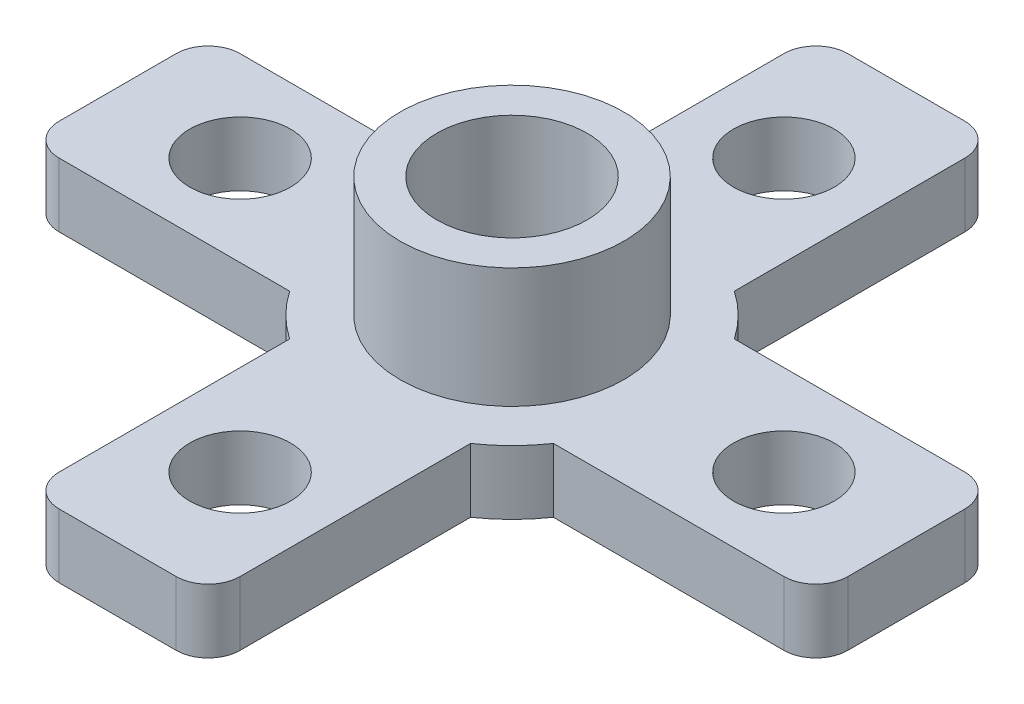
ISO-10303-21;
HEADER;
FILE_DESCRIPTION(('STEP AP214'),'2;1');
FILE_NAME('part.step','',(''),(''),'','','');
FILE_SCHEMA(('AUTOMOTIVE_DESIGN { 1 0 10303 214 1 1 1 1 }'));
ENDSEC;
DATA;
#1=APPLICATION_CONTEXT('core data for automotive mechanical design processes');
#2=APPLICATION_PROTOCOL_DEFINITION('international standard','automotive_design',2000,#1);
#3=PRODUCT_CONTEXT('',#1,'mechanical');
#4=PRODUCT('Part','Part','',(#3));
#5=PRODUCT_RELATED_PRODUCT_CATEGORY('part','',(#4));
#6=PRODUCT_DEFINITION_FORMATION('','',#4);
#7=PRODUCT_DEFINITION_CONTEXT('part definition',#1,'design');
#8=PRODUCT_DEFINITION('design','',#6,#7);
#9=PRODUCT_DEFINITION_SHAPE('','',#8);
#10=(LENGTH_UNIT() NAMED_UNIT(*) SI_UNIT(.MILLI.,.METRE.));
#11=(NAMED_UNIT(*) PLANE_ANGLE_UNIT() SI_UNIT($,.RADIAN.));
#12=(NAMED_UNIT(*) SI_UNIT($,.STERADIAN.) SOLID_ANGLE_UNIT());
#13=UNCERTAINTY_MEASURE_WITH_UNIT(LENGTH_MEASURE(1.E-05),#10,'distance_accuracy_value','');
#14=(GEOMETRIC_REPRESENTATION_CONTEXT(3) GLOBAL_UNCERTAINTY_ASSIGNED_CONTEXT((#13)) GLOBAL_UNIT_ASSIGNED_CONTEXT((#10,
#11,#12)) REPRESENTATION_CONTEXT('',''));
#15=CARTESIAN_POINT('',(0.,0.,0.));
#16=DIRECTION('',(0.,0.,1.));
#17=DIRECTION('',(1.,0.,0.));
#18=AXIS2_PLACEMENT_3D('',#15,#16,#17);
#19=CARTESIAN_POINT('',(0.,2.,0.));
#20=DIRECTION('',(0.,-1.,0.));
#21=DIRECTION('',(0.,0.,-1.));
#22=AXIS2_PLACEMENT_3D('',#19,#20,#21);
#23=CYLINDRICAL_SURFACE('',#22,3.);
#24=CARTESIAN_POINT('',(0.,1.,0.));
#25=DIRECTION('',(0.,1.,0.));
#26=DIRECTION('',(0.,0.,1.));
#27=AXIS2_PLACEMENT_3D('',#24,#25,#26);
#28=CIRCLE('',#27,3.);
#29=CARTESIAN_POINT('',(0.,1.,3.));
#30=VERTEX_POINT('',#29);
#31=EDGE_CURVE('E108',#30,#30,#28,.T.);
#32=ORIENTED_EDGE('',*,*,#31,.T.);
#33=EDGE_LOOP('',(#32));
#34=FACE_BOUND('',#33,.T.);
#35=CARTESIAN_POINT('',(0.,2.,0.));
#36=DIRECTION('',(0.,1.,0.));
#37=DIRECTION('',(0.,0.,1.));
#38=AXIS2_PLACEMENT_3D('',#35,#36,#37);
#39=CIRCLE('',#38,3.);
#40=CARTESIAN_POINT('',(0.,2.,3.));
#41=VERTEX_POINT('',#40);
#42=EDGE_CURVE('E104',#41,#41,#39,.T.);
#43=ORIENTED_EDGE('',*,*,#42,.F.);
#44=EDGE_LOOP('',(#43));
#45=FACE_BOUND('',#44,.T.);
#46=ADVANCED_FACE('F98',(#34,#45),#23,.T.);
#47=CARTESIAN_POINT('',(0.,2.,0.));
#48=DIRECTION('',(0.,-1.,0.));
#49=DIRECTION('',(0.,0.,-1.));
#50=AXIS2_PLACEMENT_3D('',#47,#48,#49);
#51=CYLINDRICAL_SURFACE('',#50,1.125);
#52=CARTESIAN_POINT('',(0.,1.,0.));
#53=DIRECTION('',(0.,1.,0.));
#54=DIRECTION('',(0.,0.,1.));
#55=AXIS2_PLACEMENT_3D('',#52,#53,#54);
#56=CIRCLE('',#55,1.125);
#57=CARTESIAN_POINT('',(0.,1.,1.125));
#58=VERTEX_POINT('',#57);
#59=EDGE_CURVE('E112',#58,#58,#56,.T.);
#60=ORIENTED_EDGE('',*,*,#59,.F.);
#61=EDGE_LOOP('',(#60));
#62=FACE_BOUND('',#61,.T.);
#63=CARTESIAN_POINT('',(0.,2.,0.));
#64=DIRECTION('',(0.,1.,0.));
#65=DIRECTION('',(0.,0.,1.));
#66=AXIS2_PLACEMENT_3D('',#63,#64,#65);
#67=CIRCLE('',#66,1.125);
#68=CARTESIAN_POINT('',(0.,2.,1.125));
#69=VERTEX_POINT('',#68);
#70=EDGE_CURVE('E12',#69,#69,#67,.T.);
#71=ORIENTED_EDGE('',*,*,#70,.T.);
#72=EDGE_LOOP('',(#71));
#73=FACE_BOUND('',#72,.T.);
#74=ADVANCED_FACE('F121',(#62,#73),#51,.F.);
#75=CARTESIAN_POINT('',(0.,2.,0.));
#76=DIRECTION('',(0.,1.,0.));
#77=DIRECTION('',(0.,0.,1.));
#78=AXIS2_PLACEMENT_3D('',#75,#76,#77);
#79=PLANE('',#78);
#80=ORIENTED_EDGE('',*,*,#42,.T.);
#81=EDGE_LOOP('',(#80));
#82=FACE_BOUND('',#81,.T.);
#83=ORIENTED_EDGE('',*,*,#70,.F.);
#84=EDGE_LOOP('',(#83));
#85=FACE_BOUND('',#84,.T.);
#86=ADVANCED_FACE('F123',(#82,#85),#79,.T.);
#87=CARTESIAN_POINT('',(0.,1.,0.));
#88=DIRECTION('',(0.,1.,0.));
#89=DIRECTION('',(0.,0.,1.));
#90=AXIS2_PLACEMENT_3D('',#87,#88,#89);
#91=PLANE('',#90);
#92=ORIENTED_EDGE('',*,*,#59,.T.);
#93=EDGE_LOOP('',(#92));
#94=FACE_BOUND('',#93,.T.);
#95=ORIENTED_EDGE('',*,*,#31,.F.);
#96=EDGE_LOOP('',(#95));
#97=FACE_BOUND('',#96,.T.);
#98=ADVANCED_FACE('F118',(#94,#97),#91,.F.);
#99=CLOSED_SHELL('',(#46,#74,#86,#98));
#100=MANIFOLD_SOLID_BREP('B2',#99);
#101=CARTESIAN_POINT('',(0.,2.,0.));
#102=DIRECTION('',(0.,-1.,0.));
#103=DIRECTION('',(0.,0.,-1.));
#104=AXIS2_PLACEMENT_3D('',#101,#102,#103);
#105=CYLINDRICAL_SURFACE('',#104,5.);
#106=CARTESIAN_POINT('',(0.,0.,0.));
#107=DIRECTION('',(0.,1.,0.));
#108=DIRECTION('',(0.,0.,1.));
#109=AXIS2_PLACEMENT_3D('',#106,#107,#108);
#110=CIRCLE('',#109,5.);
#111=CARTESIAN_POINT('',(-2.82842712474619,0.,-4.12310562561766));
#112=VERTEX_POINT('',#111);
#113=CARTESIAN_POINT('',(-4.12310562561766,0.,-2.82842712474619));
#114=VERTEX_POINT('',#113);
#115=EDGE_CURVE('E385',#112,#114,#110,.T.);
#116=ORIENTED_EDGE('',*,*,#115,.T.);
#117=DIRECTION('',(0.,-1.,0.));
#118=VECTOR('',#117,1.);
#119=CARTESIAN_POINT('',(-4.12310562561766,2.,-2.82842712474619));
#120=LINE('',#119,#118);
#121=CARTESIAN_POINT('',(-4.12310562561766,2.,-2.82842712474619));
#122=VERTEX_POINT('',#121);
#123=EDGE_CURVE('E368',#122,#114,#120,.T.);
#124=ORIENTED_EDGE('',*,*,#123,.F.);
#125=CARTESIAN_POINT('',(0.,2.,0.));
#126=DIRECTION('',(0.,1.,0.));
#127=DIRECTION('',(0.,0.,1.));
#128=AXIS2_PLACEMENT_3D('',#125,#126,#127);
#129=CIRCLE('',#128,5.);
#130=CARTESIAN_POINT('',(-2.82842712474619,2.,-4.12310562561766));
#131=VERTEX_POINT('',#130);
#132=EDGE_CURVE('E374',#131,#122,#129,.T.);
#133=ORIENTED_EDGE('',*,*,#132,.F.);
#134=DIRECTION('',(0.,-1.,0.));
#135=VECTOR('',#134,1.);
#136=CARTESIAN_POINT('',(-2.82842712474619,2.,-4.12310562561766));
#137=LINE('',#136,#135);
#138=EDGE_CURVE('E525',#131,#112,#137,.T.);
#139=ORIENTED_EDGE('',*,*,#138,.T.);
#140=EDGE_LOOP('',(#116,#124,#133,#139));
#141=FACE_BOUND('',#140,.T.);
#142=ADVANCED_FACE('F199',(#141),#105,.T.);
#143=CARTESIAN_POINT('',(0.,2.,-2.82842712474619));
#144=DIRECTION('',(0.,0.,-1.));
#145=DIRECTION('',(-1.,0.,0.));
#146=AXIS2_PLACEMENT_3D('',#143,#144,#145);
#147=PLANE('',#146);
#148=DIRECTION('',(1.,0.,0.));
#149=VECTOR('',#148,1.);
#150=CARTESIAN_POINT('',(0.,0.,-2.82842712474619));
#151=LINE('',#150,#149);
#152=CARTESIAN_POINT('',(-11.3284271247462,0.,-2.82842712474619));
#153=VERTEX_POINT('',#152);
#154=EDGE_CURVE('E559',#153,#114,#151,.T.);
#155=ORIENTED_EDGE('',*,*,#154,.F.);
#156=DIRECTION('',(0.,-1.,0.));
#157=VECTOR('',#156,1.);
#158=CARTESIAN_POINT('',(-11.3284271247462,2.,-2.82842712474619));
#159=LINE('',#158,#157);
#160=CARTESIAN_POINT('',(-11.3284271247462,2.,-2.82842712474619));
#161=VERTEX_POINT('',#160);
#162=EDGE_CURVE('E371',#153,#161,#159,.F.);
#163=ORIENTED_EDGE('',*,*,#162,.T.);
#164=DIRECTION('',(1.,0.,0.));
#165=VECTOR('',#164,1.);
#166=CARTESIAN_POINT('',(0.,2.,-2.82842712474619));
#167=LINE('',#166,#165);
#168=EDGE_CURVE('E363',#161,#122,#167,.T.);
#169=ORIENTED_EDGE('',*,*,#168,.T.);
#170=ORIENTED_EDGE('',*,*,#123,.T.);
#171=EDGE_LOOP('',(#155,#163,#169,#170));
#172=FACE_BOUND('',#171,.T.);
#173=ADVANCED_FACE('F366',(#172),#147,.T.);
#174=CARTESIAN_POINT('',(-12.3284271247462,2.,0.));
#175=DIRECTION('',(-1.,0.,0.));
#176=DIRECTION('',(0.,0.,1.));
#177=AXIS2_PLACEMENT_3D('',#174,#175,#176);
#178=PLANE('',#177);
#179=DIRECTION('',(0.,0.,-1.));
#180=VECTOR('',#179,1.);
#181=CARTESIAN_POINT('',(-12.3284271247462,2.,0.));
#182=LINE('',#181,#180);
#183=CARTESIAN_POINT('',(-12.3284271247462,2.,1.82842712474619));
#184=VERTEX_POINT('',#183);
#185=CARTESIAN_POINT('',(-12.3284271247462,2.,-1.82842712474619));
#186=VERTEX_POINT('',#185);
#187=EDGE_CURVE('E373',#184,#186,#182,.T.);
#188=ORIENTED_EDGE('',*,*,#187,.T.);
#189=DIRECTION('',(0.,-1.,0.));
#190=VECTOR('',#189,1.);
#191=CARTESIAN_POINT('',(-12.3284271247462,2.,-1.82842712474619));
#192=LINE('',#191,#190);
#193=CARTESIAN_POINT('',(-12.3284271247462,0.,-1.82842712474619));
#194=VERTEX_POINT('',#193);
#195=EDGE_CURVE('E442',#186,#194,#192,.T.);
#196=ORIENTED_EDGE('',*,*,#195,.T.);
#197=DIRECTION('',(0.,0.,-1.));
#198=VECTOR('',#197,1.);
#199=CARTESIAN_POINT('',(-12.3284271247462,0.,0.));
#200=LINE('',#199,#198);
#201=CARTESIAN_POINT('',(-12.3284271247462,0.,1.82842712474619));
#202=VERTEX_POINT('',#201);
#203=EDGE_CURVE('E554',#202,#194,#200,.T.);
#204=ORIENTED_EDGE('',*,*,#203,.F.);
#205=DIRECTION('',(0.,-1.,0.));
#206=VECTOR('',#205,1.);
#207=CARTESIAN_POINT('',(-12.3284271247462,2.,1.82842712474619));
#208=LINE('',#207,#206);
#209=EDGE_CURVE('E440',#202,#184,#208,.F.);
#210=ORIENTED_EDGE('',*,*,#209,.T.);
#211=EDGE_LOOP('',(#188,#196,#204,#210));
#212=FACE_BOUND('',#211,.T.);
#213=ADVANCED_FACE('F647',(#212),#178,.T.);
#214=CARTESIAN_POINT('',(0.,2.,2.82842712474619));
#215=DIRECTION('',(0.,0.,1.));
#216=DIRECTION('',(1.,0.,0.));
#217=AXIS2_PLACEMENT_3D('',#214,#215,#216);
#218=PLANE('',#217);
#219=DIRECTION('',(-1.,0.,0.));
#220=VECTOR('',#219,1.);
#221=CARTESIAN_POINT('',(0.,2.,2.82842712474619));
#222=LINE('',#221,#220);
#223=CARTESIAN_POINT('',(-4.12310562561766,2.,2.82842712474619));
#224=VERTEX_POINT('',#223);
#225=CARTESIAN_POINT('',(-11.3284271247462,2.,2.82842712474619));
#226=VERTEX_POINT('',#225);
#227=EDGE_CURVE('E600',#224,#226,#222,.T.);
#228=ORIENTED_EDGE('',*,*,#227,.T.);
#229=DIRECTION('',(0.,-1.,0.));
#230=VECTOR('',#229,1.);
#231=CARTESIAN_POINT('',(-11.3284271247462,2.,2.82842712474619));
#232=LINE('',#231,#230);
#233=CARTESIAN_POINT('',(-11.3284271247462,0.,2.82842712474619));
#234=VERTEX_POINT('',#233);
#235=EDGE_CURVE('E446',#226,#234,#232,.T.);
#236=ORIENTED_EDGE('',*,*,#235,.T.);
#237=DIRECTION('',(-1.,0.,0.));
#238=VECTOR('',#237,1.);
#239=CARTESIAN_POINT('',(0.,0.,2.82842712474619));
#240=LINE('',#239,#238);
#241=CARTESIAN_POINT('',(-4.12310562561766,0.,2.82842712474619));
#242=VERTEX_POINT('',#241);
#243=EDGE_CURVE('E552',#242,#234,#240,.T.);
#244=ORIENTED_EDGE('',*,*,#243,.F.);
#245=DIRECTION('',(0.,-1.,0.));
#246=VECTOR('',#245,1.);
#247=CARTESIAN_POINT('',(-4.12310562561766,2.,2.82842712474619));
#248=LINE('',#247,#246);
#249=EDGE_CURVE('E387',#224,#242,#248,.T.);
#250=ORIENTED_EDGE('',*,*,#249,.F.);
#251=EDGE_LOOP('',(#228,#236,#244,#250));
#252=FACE_BOUND('',#251,.T.);
#253=ADVANCED_FACE('F683',(#252),#218,.T.);
#254=CARTESIAN_POINT('',(0.,2.,0.));
#255=DIRECTION('',(0.,-1.,0.));
#256=DIRECTION('',(0.,0.,-1.));
#257=AXIS2_PLACEMENT_3D('',#254,#255,#256);
#258=CYLINDRICAL_SURFACE('',#257,5.);
#259=CARTESIAN_POINT('',(0.,0.,0.));
#260=DIRECTION('',(0.,1.,0.));
#261=DIRECTION('',(0.,0.,1.));
#262=AXIS2_PLACEMENT_3D('',#259,#260,#261);
#263=CIRCLE('',#262,5.);
#264=CARTESIAN_POINT('',(-2.82842712474619,0.,4.12310562561766));
#265=VERTEX_POINT('',#264);
#266=EDGE_CURVE('E548',#242,#265,#263,.T.);
#267=ORIENTED_EDGE('',*,*,#266,.T.);
#268=DIRECTION('',(0.,-1.,0.));
#269=VECTOR('',#268,1.);
#270=CARTESIAN_POINT('',(-2.82842712474619,2.,4.12310562561766));
#271=LINE('',#270,#269);
#272=CARTESIAN_POINT('',(-2.82842712474619,2.,4.12310562561766));
#273=VERTEX_POINT('',#272);
#274=EDGE_CURVE('E391',#273,#265,#271,.T.);
#275=ORIENTED_EDGE('',*,*,#274,.F.);
#276=CARTESIAN_POINT('',(0.,2.,0.));
#277=DIRECTION('',(0.,1.,0.));
#278=DIRECTION('',(0.,0.,1.));
#279=AXIS2_PLACEMENT_3D('',#276,#277,#278);
#280=CIRCLE('',#279,5.);
#281=EDGE_CURVE('E598',#224,#273,#280,.T.);
#282=ORIENTED_EDGE('',*,*,#281,.F.);
#283=ORIENTED_EDGE('',*,*,#249,.T.);
#284=EDGE_LOOP('',(#267,#275,#282,#283));
#285=FACE_BOUND('',#284,.T.);
#286=ADVANCED_FACE('F549',(#285),#258,.T.);
#287=CARTESIAN_POINT('',(-2.82842712474619,2.,0.));
#288=DIRECTION('',(-1.,0.,0.));
#289=DIRECTION('',(0.,0.,1.));
#290=AXIS2_PLACEMENT_3D('',#287,#288,#289);
#291=PLANE('',#290);
#292=DIRECTION('',(0.,0.,-1.));
#293=VECTOR('',#292,1.);
#294=CARTESIAN_POINT('',(-2.82842712474619,0.,0.));
#295=LINE('',#294,#293);
#296=CARTESIAN_POINT('',(-2.82842712474619,0.,11.3284271247462));
#297=VERTEX_POINT('',#296);
#298=EDGE_CURVE('E493',#297,#265,#295,.T.);
#299=ORIENTED_EDGE('',*,*,#298,.F.);
#300=DIRECTION('',(0.,-1.,0.));
#301=VECTOR('',#300,1.);
#302=CARTESIAN_POINT('',(-2.82842712474619,2.,11.3284271247462));
#303=LINE('',#302,#301);
#304=CARTESIAN_POINT('',(-2.82842712474619,2.,11.3284271247462));
#305=VERTEX_POINT('',#304);
#306=EDGE_CURVE('E96',#297,#305,#303,.F.);
#307=ORIENTED_EDGE('',*,*,#306,.T.);
#308=DIRECTION('',(0.,0.,-1.));
#309=VECTOR('',#308,1.);
#310=CARTESIAN_POINT('',(-2.82842712474619,2.,0.));
#311=LINE('',#310,#309);
#312=EDGE_CURVE('E474',#305,#273,#311,.T.);
#313=ORIENTED_EDGE('',*,*,#312,.T.);
#314=ORIENTED_EDGE('',*,*,#274,.T.);
#315=EDGE_LOOP('',(#299,#307,#313,#314));
#316=FACE_BOUND('',#315,.T.);
#317=ADVANCED_FACE('F542',(#316),#291,.T.);
#318=CARTESIAN_POINT('',(0.,2.,12.3284271247462));
#319=DIRECTION('',(0.,0.,1.));
#320=DIRECTION('',(1.,0.,0.));
#321=AXIS2_PLACEMENT_3D('',#318,#319,#320);
#322=PLANE('',#321);
#323=DIRECTION('',(-1.,0.,0.));
#324=VECTOR('',#323,1.);
#325=CARTESIAN_POINT('',(0.,0.,12.3284271247462));
#326=LINE('',#325,#324);
#327=CARTESIAN_POINT('',(1.82842712474619,0.,12.3284271247462));
#328=VERTEX_POINT('',#327);
#329=CARTESIAN_POINT('',(-1.82842712474619,0.,12.3284271247462));
#330=VERTEX_POINT('',#329);
#331=EDGE_CURVE('E466',#328,#330,#326,.T.);
#332=ORIENTED_EDGE('',*,*,#331,.F.);
#333=DIRECTION('',(0.,-1.,0.));
#334=VECTOR('',#333,1.);
#335=CARTESIAN_POINT('',(1.82842712474619,2.,12.3284271247462));
#336=LINE('',#335,#334);
#337=CARTESIAN_POINT('',(1.82842712474619,2.,12.3284271247462));
#338=VERTEX_POINT('',#337);
#339=EDGE_CURVE('E208',#328,#338,#336,.F.);
#340=ORIENTED_EDGE('',*,*,#339,.T.);
#341=DIRECTION('',(-1.,0.,0.));
#342=VECTOR('',#341,1.);
#343=CARTESIAN_POINT('',(0.,2.,12.3284271247462));
#344=LINE('',#343,#342);
#345=CARTESIAN_POINT('',(-1.82842712474619,2.,12.3284271247462));
#346=VERTEX_POINT('',#345);
#347=EDGE_CURVE('E463',#338,#346,#344,.T.);
#348=ORIENTED_EDGE('',*,*,#347,.T.);
#349=DIRECTION('',(0.,-1.,0.));
#350=VECTOR('',#349,1.);
#351=CARTESIAN_POINT('',(-1.82842712474619,2.,12.3284271247462));
#352=LINE('',#351,#350);
#353=EDGE_CURVE('E454',#346,#330,#352,.T.);
#354=ORIENTED_EDGE('',*,*,#353,.T.);
#355=EDGE_LOOP('',(#332,#340,#348,#354));
#356=FACE_BOUND('',#355,.T.);
#357=ADVANCED_FACE('F462',(#356),#322,.T.);
#358=CARTESIAN_POINT('',(2.82842712474619,2.,0.));
#359=DIRECTION('',(1.,0.,0.));
#360=DIRECTION('',(0.,0.,-1.));
#361=AXIS2_PLACEMENT_3D('',#358,#359,#360);
#362=PLANE('',#361);
#363=DIRECTION('',(0.,0.,1.));
#364=VECTOR('',#363,1.);
#365=CARTESIAN_POINT('',(2.82842712474619,2.,0.));
#366=LINE('',#365,#364);
#367=CARTESIAN_POINT('',(2.82842712474619,2.,4.12310562561766));
#368=VERTEX_POINT('',#367);
#369=CARTESIAN_POINT('',(2.82842712474619,2.,11.3284271247462));
#370=VERTEX_POINT('',#369);
#371=EDGE_CURVE('E473',#368,#370,#366,.T.);
#372=ORIENTED_EDGE('',*,*,#371,.T.);
#373=DIRECTION('',(0.,-1.,0.));
#374=VECTOR('',#373,1.);
#375=CARTESIAN_POINT('',(2.82842712474619,2.,11.3284271247462));
#376=LINE('',#375,#374);
#377=CARTESIAN_POINT('',(2.82842712474619,0.,11.3284271247462));
#378=VERTEX_POINT('',#377);
#379=EDGE_CURVE('E451',#370,#378,#376,.T.);
#380=ORIENTED_EDGE('',*,*,#379,.T.);
#381=DIRECTION('',(0.,0.,1.));
#382=VECTOR('',#381,1.);
#383=CARTESIAN_POINT('',(2.82842712474619,0.,0.));
#384=LINE('',#383,#382);
#385=CARTESIAN_POINT('',(2.82842712474619,0.,4.12310562561766));
#386=VERTEX_POINT('',#385);
#387=EDGE_CURVE('E482',#386,#378,#384,.T.);
#388=ORIENTED_EDGE('',*,*,#387,.F.);
#389=DIRECTION('',(0.,-1.,0.));
#390=VECTOR('',#389,1.);
#391=CARTESIAN_POINT('',(2.82842712474619,2.,4.12310562561766));
#392=LINE('',#391,#390);
#393=EDGE_CURVE('E536',#368,#386,#392,.T.);
#394=ORIENTED_EDGE('',*,*,#393,.F.);
#395=EDGE_LOOP('',(#372,#380,#388,#394));
#396=FACE_BOUND('',#395,.T.);
#397=ADVANCED_FACE('F481',(#396),#362,.T.);
#398=CARTESIAN_POINT('',(0.,2.,0.));
#399=DIRECTION('',(0.,-1.,0.));
#400=DIRECTION('',(0.,0.,-1.));
#401=AXIS2_PLACEMENT_3D('',#398,#399,#400);
#402=CYLINDRICAL_SURFACE('',#401,5.);
#403=CARTESIAN_POINT('',(0.,0.,0.));
#404=DIRECTION('',(0.,1.,0.));
#405=DIRECTION('',(0.,0.,1.));
#406=AXIS2_PLACEMENT_3D('',#403,#404,#405);
#407=CIRCLE('',#406,5.);
#408=CARTESIAN_POINT('',(4.12310562561766,0.,2.82842712474619));
#409=VERTEX_POINT('',#408);
#410=EDGE_CURVE('E489',#386,#409,#407,.T.);
#411=ORIENTED_EDGE('',*,*,#410,.T.);
#412=DIRECTION('',(0.,-1.,0.));
#413=VECTOR('',#412,1.);
#414=CARTESIAN_POINT('',(4.12310562561766,2.,2.82842712474619));
#415=LINE('',#414,#413);
#416=CARTESIAN_POINT('',(4.12310562561766,2.,2.82842712474619));
#417=VERTEX_POINT('',#416);
#418=EDGE_CURVE('E533',#417,#409,#415,.T.);
#419=ORIENTED_EDGE('',*,*,#418,.F.);
#420=CARTESIAN_POINT('',(0.,2.,0.));
#421=DIRECTION('',(0.,1.,0.));
#422=DIRECTION('',(0.,0.,1.));
#423=AXIS2_PLACEMENT_3D('',#420,#421,#422);
#424=CIRCLE('',#423,5.);
#425=EDGE_CURVE('E593',#368,#417,#424,.T.);
#426=ORIENTED_EDGE('',*,*,#425,.F.);
#427=ORIENTED_EDGE('',*,*,#393,.T.);
#428=EDGE_LOOP('',(#411,#419,#426,#427));
#429=FACE_BOUND('',#428,.T.);
#430=ADVANCED_FACE('F725',(#429),#402,.T.);
#431=CARTESIAN_POINT('',(0.,2.,2.82842712474619));
#432=DIRECTION('',(0.,0.,1.));
#433=DIRECTION('',(1.,0.,0.));
#434=AXIS2_PLACEMENT_3D('',#431,#432,#433);
#435=PLANE('',#434);
#436=DIRECTION('',(-1.,0.,0.));
#437=VECTOR('',#436,1.);
#438=CARTESIAN_POINT('',(0.,0.,2.82842712474619));
#439=LINE('',#438,#437);
#440=CARTESIAN_POINT('',(11.3284271247462,0.,2.82842712474619));
#441=VERTEX_POINT('',#440);
#442=EDGE_CURVE('E491',#441,#409,#439,.T.);
#443=ORIENTED_EDGE('',*,*,#442,.F.);
#444=DIRECTION('',(0.,-1.,0.));
#445=VECTOR('',#444,1.);
#446=CARTESIAN_POINT('',(11.3284271247462,2.,2.82842712474619));
#447=LINE('',#446,#445);
#448=CARTESIAN_POINT('',(11.3284271247462,2.,2.82842712474619));
#449=VERTEX_POINT('',#448);
#450=EDGE_CURVE('E449',#441,#449,#447,.F.);
#451=ORIENTED_EDGE('',*,*,#450,.T.);
#452=DIRECTION('',(-1.,0.,0.));
#453=VECTOR('',#452,1.);
#454=CARTESIAN_POINT('',(0.,2.,2.82842712474619));
#455=LINE('',#454,#453);
#456=EDGE_CURVE('E591',#449,#417,#455,.T.);
#457=ORIENTED_EDGE('',*,*,#456,.T.);
#458=ORIENTED_EDGE('',*,*,#418,.T.);
#459=EDGE_LOOP('',(#443,#451,#457,#458));
#460=FACE_BOUND('',#459,.T.);
#461=ADVANCED_FACE('F720',(#460),#435,.T.);
#462=CARTESIAN_POINT('',(12.3284271247462,2.,0.));
#463=DIRECTION('',(1.,0.,0.));
#464=DIRECTION('',(0.,0.,-1.));
#465=AXIS2_PLACEMENT_3D('',#462,#463,#464);
#466=PLANE('',#465);
#467=DIRECTION('',(0.,0.,1.));
#468=VECTOR('',#467,1.);
#469=CARTESIAN_POINT('',(12.3284271247462,0.,0.));
#470=LINE('',#469,#468);
#471=CARTESIAN_POINT('',(12.3284271247462,0.,-1.82842712474619));
#472=VERTEX_POINT('',#471);
#473=CARTESIAN_POINT('',(12.3284271247462,0.,1.82842712474619));
#474=VERTEX_POINT('',#473);
#475=EDGE_CURVE('E498',#472,#474,#470,.T.);
#476=ORIENTED_EDGE('',*,*,#475,.F.);
#477=DIRECTION('',(0.,-1.,0.));
#478=VECTOR('',#477,1.);
#479=CARTESIAN_POINT('',(12.3284271247462,2.,-1.82842712474619));
#480=LINE('',#479,#478);
#481=CARTESIAN_POINT('',(12.3284271247462,2.,-1.82842712474619));
#482=VERTEX_POINT('',#481);
#483=EDGE_CURVE('E435',#472,#482,#480,.F.);
#484=ORIENTED_EDGE('',*,*,#483,.T.);
#485=DIRECTION('',(0.,0.,1.));
#486=VECTOR('',#485,1.);
#487=CARTESIAN_POINT('',(12.3284271247462,2.,0.));
#488=LINE('',#487,#486);
#489=CARTESIAN_POINT('',(12.3284271247462,2.,1.82842712474619));
#490=VERTEX_POINT('',#489);
#491=EDGE_CURVE('E588',#482,#490,#488,.T.);
#492=ORIENTED_EDGE('',*,*,#491,.T.);
#493=DIRECTION('',(0.,-1.,0.));
#494=VECTOR('',#493,1.);
#495=CARTESIAN_POINT('',(12.3284271247462,2.,1.82842712474619));
#496=LINE('',#495,#494);
#497=EDGE_CURVE('E432',#490,#474,#496,.T.);
#498=ORIENTED_EDGE('',*,*,#497,.T.);
#499=EDGE_LOOP('',(#476,#484,#492,#498));
#500=FACE_BOUND('',#499,.T.);
#501=ADVANCED_FACE('F714',(#500),#466,.T.);
#502=CARTESIAN_POINT('',(0.,2.,-2.82842712474619));
#503=DIRECTION('',(0.,0.,-1.));
#504=DIRECTION('',(-1.,0.,0.));
#505=AXIS2_PLACEMENT_3D('',#502,#503,#504);
#506=PLANE('',#505);
#507=DIRECTION('',(1.,0.,0.));
#508=VECTOR('',#507,1.);
#509=CARTESIAN_POINT('',(0.,2.,-2.82842712474619));
#510=LINE('',#509,#508);
#511=CARTESIAN_POINT('',(4.12310562561766,2.,-2.82842712474619));
#512=VERTEX_POINT('',#511);
#513=CARTESIAN_POINT('',(11.3284271247462,2.,-2.82842712474619));
#514=VERTEX_POINT('',#513);
#515=EDGE_CURVE('E586',#512,#514,#510,.T.);
#516=ORIENTED_EDGE('',*,*,#515,.T.);
#517=DIRECTION('',(0.,-1.,0.));
#518=VECTOR('',#517,1.);
#519=CARTESIAN_POINT('',(11.3284271247462,2.,-2.82842712474619));
#520=LINE('',#519,#518);
#521=CARTESIAN_POINT('',(11.3284271247462,0.,-2.82842712474619));
#522=VERTEX_POINT('',#521);
#523=EDGE_CURVE('E429',#514,#522,#520,.T.);
#524=ORIENTED_EDGE('',*,*,#523,.T.);
#525=DIRECTION('',(1.,0.,0.));
#526=VECTOR('',#525,1.);
#527=CARTESIAN_POINT('',(0.,0.,-2.82842712474619));
#528=LINE('',#527,#526);
#529=CARTESIAN_POINT('',(4.12310562561766,0.,-2.82842712474619));
#530=VERTEX_POINT('',#529);
#531=EDGE_CURVE('E501',#530,#522,#528,.T.);
#532=ORIENTED_EDGE('',*,*,#531,.F.);
#533=DIRECTION('',(0.,-1.,0.));
#534=VECTOR('',#533,1.);
#535=CARTESIAN_POINT('',(4.12310562561766,2.,-2.82842712474619));
#536=LINE('',#535,#534);
#537=EDGE_CURVE('E531',#512,#530,#536,.T.);
#538=ORIENTED_EDGE('',*,*,#537,.F.);
#539=EDGE_LOOP('',(#516,#524,#532,#538));
#540=FACE_BOUND('',#539,.T.);
#541=ADVANCED_FACE('F709',(#540),#506,.T.);
#542=CARTESIAN_POINT('',(0.,2.,0.));
#543=DIRECTION('',(0.,-1.,0.));
#544=DIRECTION('',(0.,0.,-1.));
#545=AXIS2_PLACEMENT_3D('',#542,#543,#544);
#546=CYLINDRICAL_SURFACE('',#545,5.);
#547=CARTESIAN_POINT('',(0.,0.,0.));
#548=DIRECTION('',(0.,1.,0.));
#549=DIRECTION('',(0.,0.,1.));
#550=AXIS2_PLACEMENT_3D('',#547,#548,#549);
#551=CIRCLE('',#550,5.);
#552=CARTESIAN_POINT('',(2.82842712474619,0.,-4.12310562561766));
#553=VERTEX_POINT('',#552);
#554=EDGE_CURVE('E504',#530,#553,#551,.T.);
#555=ORIENTED_EDGE('',*,*,#554,.T.);
#556=DIRECTION('',(0.,-1.,0.));
#557=VECTOR('',#556,1.);
#558=CARTESIAN_POINT('',(2.82842712474619,2.,-4.12310562561766));
#559=LINE('',#558,#557);
#560=CARTESIAN_POINT('',(2.82842712474619,2.,-4.12310562561766));
#561=VERTEX_POINT('',#560);
#562=EDGE_CURVE('E527',#561,#553,#559,.T.);
#563=ORIENTED_EDGE('',*,*,#562,.F.);
#564=CARTESIAN_POINT('',(0.,2.,0.));
#565=DIRECTION('',(0.,1.,0.));
#566=DIRECTION('',(0.,0.,1.));
#567=AXIS2_PLACEMENT_3D('',#564,#565,#566);
#568=CIRCLE('',#567,5.);
#569=EDGE_CURVE('E583',#512,#561,#568,.T.);
#570=ORIENTED_EDGE('',*,*,#569,.F.);
#571=ORIENTED_EDGE('',*,*,#537,.T.);
#572=EDGE_LOOP('',(#555,#563,#570,#571));
#573=FACE_BOUND('',#572,.T.);
#574=ADVANCED_FACE('F706',(#573),#546,.T.);
#575=CARTESIAN_POINT('',(2.82842712474619,2.,0.));
#576=DIRECTION('',(1.,0.,0.));
#577=DIRECTION('',(0.,0.,-1.));
#578=AXIS2_PLACEMENT_3D('',#575,#576,#577);
#579=PLANE('',#578);
#580=DIRECTION('',(0.,0.,1.));
#581=VECTOR('',#580,1.);
#582=CARTESIAN_POINT('',(2.82842712474619,0.,0.));
#583=LINE('',#582,#581);
#584=CARTESIAN_POINT('',(2.82842712474619,0.,-11.3284271247462));
#585=VERTEX_POINT('',#584);
#586=EDGE_CURVE('E507',#585,#553,#583,.T.);
#587=ORIENTED_EDGE('',*,*,#586,.F.);
#588=DIRECTION('',(0.,-1.,0.));
#589=VECTOR('',#588,1.);
#590=CARTESIAN_POINT('',(2.82842712474619,2.,-11.3284271247462));
#591=LINE('',#590,#589);
#592=CARTESIAN_POINT('',(2.82842712474619,2.,-11.3284271247462));
#593=VERTEX_POINT('',#592);
#594=EDGE_CURVE('E413',#585,#593,#591,.F.);
#595=ORIENTED_EDGE('',*,*,#594,.T.);
#596=DIRECTION('',(0.,0.,1.));
#597=VECTOR('',#596,1.);
#598=CARTESIAN_POINT('',(2.82842712474619,2.,0.));
#599=LINE('',#598,#597);
#600=EDGE_CURVE('E581',#593,#561,#599,.T.);
#601=ORIENTED_EDGE('',*,*,#600,.T.);
#602=ORIENTED_EDGE('',*,*,#562,.T.);
#603=EDGE_LOOP('',(#587,#595,#601,#602));
#604=FACE_BOUND('',#603,.T.);
#605=ADVANCED_FACE('F702',(#604),#579,.T.);
#606=CARTESIAN_POINT('',(0.,2.,-12.3284271247462));
#607=DIRECTION('',(0.,0.,-1.));
#608=DIRECTION('',(-1.,0.,0.));
#609=AXIS2_PLACEMENT_3D('',#606,#607,#608);
#610=PLANE('',#609);
#611=DIRECTION('',(1.,0.,0.));
#612=VECTOR('',#611,1.);
#613=CARTESIAN_POINT('',(0.,2.,-12.3284271247462));
#614=LINE('',#613,#612);
#615=CARTESIAN_POINT('',(-1.82842712474619,2.,-12.3284271247462));
#616=VERTEX_POINT('',#615);
#617=CARTESIAN_POINT('',(1.82842712474619,2.,-12.3284271247462));
#618=VERTEX_POINT('',#617);
#619=EDGE_CURVE('E578',#616,#618,#614,.T.);
#620=ORIENTED_EDGE('',*,*,#619,.T.);
#621=DIRECTION('',(0.,-1.,0.));
#622=VECTOR('',#621,1.);
#623=CARTESIAN_POINT('',(1.82842712474619,2.,-12.3284271247462));
#624=LINE('',#623,#622);
#625=CARTESIAN_POINT('',(1.82842712474619,0.,-12.3284271247462));
#626=VERTEX_POINT('',#625);
#627=EDGE_CURVE('E389',#618,#626,#624,.T.);
#628=ORIENTED_EDGE('',*,*,#627,.T.);
#629=DIRECTION('',(1.,0.,0.));
#630=VECTOR('',#629,1.);
#631=CARTESIAN_POINT('',(0.,0.,-12.3284271247462));
#632=LINE('',#631,#630);
#633=CARTESIAN_POINT('',(-1.82842712474619,0.,-12.3284271247462));
#634=VERTEX_POINT('',#633);
#635=EDGE_CURVE('E509',#634,#626,#632,.T.);
#636=ORIENTED_EDGE('',*,*,#635,.F.);
#637=DIRECTION('',(0.,-1.,0.));
#638=VECTOR('',#637,1.);
#639=CARTESIAN_POINT('',(-1.82842712474619,2.,-12.3284271247462));
#640=LINE('',#639,#638);
#641=EDGE_CURVE('E386',#634,#616,#640,.F.);
#642=ORIENTED_EDGE('',*,*,#641,.T.);
#643=EDGE_LOOP('',(#620,#628,#636,#642));
#644=FACE_BOUND('',#643,.T.);
#645=ADVANCED_FACE('F695',(#644),#610,.T.);
#646=CARTESIAN_POINT('',(0.,2.,8.5));
#647=DIRECTION('',(0.,-1.,0.));
#648=DIRECTION('',(0.,0.,-1.));
#649=AXIS2_PLACEMENT_3D('',#646,#647,#648);
#650=CYLINDRICAL_SURFACE('',#649,1.57500000000006);
#651=CARTESIAN_POINT('',(0.,2.,8.5));
#652=DIRECTION('',(0.,1.,0.));
#653=DIRECTION('',(0.,0.,1.));
#654=AXIS2_PLACEMENT_3D('',#651,#652,#653);
#655=CIRCLE('',#654,1.57500000000006);
#656=CARTESIAN_POINT('',(0.,2.,10.0750000000001));
#657=VERTEX_POINT('',#656);
#658=EDGE_CURVE('E565',#657,#657,#655,.T.);
#659=ORIENTED_EDGE('',*,*,#658,.T.);
#660=EDGE_LOOP('',(#659));
#661=FACE_BOUND('',#660,.T.);
#662=CARTESIAN_POINT('',(0.,0.,8.5));
#663=DIRECTION('',(0.,1.,0.));
#664=DIRECTION('',(0.,0.,1.));
#665=AXIS2_PLACEMENT_3D('',#662,#663,#664);
#666=CIRCLE('',#665,1.57500000000006);
#667=CARTESIAN_POINT('',(0.,0.,10.0750000000001));
#668=VERTEX_POINT('',#667);
#669=EDGE_CURVE('E520',#668,#668,#666,.T.);
#670=ORIENTED_EDGE('',*,*,#669,.F.);
#671=EDGE_LOOP('',(#670));
#672=FACE_BOUND('',#671,.T.);
#673=ADVANCED_FACE('F809',(#661,#672),#650,.F.);
#674=CARTESIAN_POINT('',(0.,2.,-8.5));
#675=DIRECTION('',(0.,-1.,0.));
#676=DIRECTION('',(0.,0.,-1.));
#677=AXIS2_PLACEMENT_3D('',#674,#675,#676);
#678=CYLINDRICAL_SURFACE('',#677,1.575);
#679=CARTESIAN_POINT('',(0.,2.,-8.5));
#680=DIRECTION('',(0.,1.,0.));
#681=DIRECTION('',(0.,0.,1.));
#682=AXIS2_PLACEMENT_3D('',#679,#680,#681);
#683=CIRCLE('',#682,1.575);
#684=CARTESIAN_POINT('',(0.,2.,-6.925));
#685=VERTEX_POINT('',#684);
#686=EDGE_CURVE('E568',#685,#685,#683,.T.);
#687=ORIENTED_EDGE('',*,*,#686,.T.);
#688=EDGE_LOOP('',(#687));
#689=FACE_BOUND('',#688,.T.);
#690=CARTESIAN_POINT('',(0.,0.,-8.5));
#691=DIRECTION('',(0.,1.,0.));
#692=DIRECTION('',(0.,0.,1.));
#693=AXIS2_PLACEMENT_3D('',#690,#691,#692);
#694=CIRCLE('',#693,1.575);
#695=CARTESIAN_POINT('',(0.,0.,-6.925));
#696=VERTEX_POINT('',#695);
#697=EDGE_CURVE('E517',#696,#696,#694,.T.);
#698=ORIENTED_EDGE('',*,*,#697,.F.);
#699=EDGE_LOOP('',(#698));
#700=FACE_BOUND('',#699,.T.);
#701=ADVANCED_FACE('F1009',(#689,#700),#678,.F.);
#702=CARTESIAN_POINT('',(8.5,2.,0.));
#703=DIRECTION('',(0.,-1.,0.));
#704=DIRECTION('',(0.,0.,-1.));
#705=AXIS2_PLACEMENT_3D('',#702,#703,#704);
#706=CYLINDRICAL_SURFACE('',#705,1.57500000000003);
#707=CARTESIAN_POINT('',(8.5,2.,0.));
#708=DIRECTION('',(0.,1.,0.));
#709=DIRECTION('',(0.,0.,1.));
#710=AXIS2_PLACEMENT_3D('',#707,#708,#709);
#711=CIRCLE('',#710,1.57500000000003);
#712=CARTESIAN_POINT('',(8.5,2.,1.57500000000003));
#713=VERTEX_POINT('',#712);
#714=EDGE_CURVE('E571',#713,#713,#711,.T.);
#715=ORIENTED_EDGE('',*,*,#714,.T.);
#716=EDGE_LOOP('',(#715));
#717=FACE_BOUND('',#716,.T.);
#718=CARTESIAN_POINT('',(8.5,0.,0.));
#719=DIRECTION('',(0.,1.,0.));
#720=DIRECTION('',(0.,0.,1.));
#721=AXIS2_PLACEMENT_3D('',#718,#719,#720);
#722=CIRCLE('',#721,1.57500000000003);
#723=CARTESIAN_POINT('',(8.5,0.,1.57500000000003));
#724=VERTEX_POINT('',#723);
#725=EDGE_CURVE('E514',#724,#724,#722,.T.);
#726=ORIENTED_EDGE('',*,*,#725,.F.);
#727=EDGE_LOOP('',(#726));
#728=FACE_BOUND('',#727,.T.);
#729=ADVANCED_FACE('F821',(#717,#728),#706,.F.);
#730=CARTESIAN_POINT('',(-2.82842712474619,2.,0.));
#731=DIRECTION('',(-1.,0.,0.));
#732=DIRECTION('',(0.,0.,1.));
#733=AXIS2_PLACEMENT_3D('',#730,#731,#732);
#734=PLANE('',#733);
#735=DIRECTION('',(0.,0.,-1.));
#736=VECTOR('',#735,1.);
#737=CARTESIAN_POINT('',(-2.82842712474619,2.,0.));
#738=LINE('',#737,#736);
#739=CARTESIAN_POINT('',(-2.82842712474619,2.,-11.3284271247462));
#740=VERTEX_POINT('',#739);
#741=EDGE_CURVE('E380',#131,#740,#738,.T.);
#742=ORIENTED_EDGE('',*,*,#741,.T.);
#743=DIRECTION('',(0.,-1.,0.));
#744=VECTOR('',#743,1.);
#745=CARTESIAN_POINT('',(-2.82842712474619,2.,-11.3284271247462));
#746=LINE('',#745,#744);
#747=CARTESIAN_POINT('',(-2.82842712474619,0.,-11.3284271247462));
#748=VERTEX_POINT('',#747);
#749=EDGE_CURVE('E437',#740,#748,#746,.T.);
#750=ORIENTED_EDGE('',*,*,#749,.T.);
#751=DIRECTION('',(0.,0.,-1.));
#752=VECTOR('',#751,1.);
#753=CARTESIAN_POINT('',(-2.82842712474619,0.,0.));
#754=LINE('',#753,#752);
#755=EDGE_CURVE('E511',#112,#748,#754,.T.);
#756=ORIENTED_EDGE('',*,*,#755,.F.);
#757=ORIENTED_EDGE('',*,*,#138,.F.);
#758=EDGE_LOOP('',(#742,#750,#756,#757));
#759=FACE_BOUND('',#758,.T.);
#760=ADVANCED_FACE('F690',(#759),#734,.T.);
#761=CARTESIAN_POINT('',(-8.5,2.,0.));
#762=DIRECTION('',(0.,-1.,0.));
#763=DIRECTION('',(0.,0.,-1.));
#764=AXIS2_PLACEMENT_3D('',#761,#762,#763);
#765=CYLINDRICAL_SURFACE('',#764,1.57500000000009);
#766=CARTESIAN_POINT('',(-8.5,2.,0.));
#767=DIRECTION('',(0.,1.,0.));
#768=DIRECTION('',(0.,0.,1.));
#769=AXIS2_PLACEMENT_3D('',#766,#767,#768);
#770=CIRCLE('',#769,1.57500000000009);
#771=CARTESIAN_POINT('',(-8.5,2.,1.57500000000009));
#772=VERTEX_POINT('',#771);
#773=EDGE_CURVE('E528',#772,#772,#770,.T.);
#774=ORIENTED_EDGE('',*,*,#773,.T.);
#775=EDGE_LOOP('',(#774));
#776=FACE_BOUND('',#775,.T.);
#777=CARTESIAN_POINT('',(-8.5,0.,0.));
#778=DIRECTION('',(0.,1.,0.));
#779=DIRECTION('',(0.,0.,1.));
#780=AXIS2_PLACEMENT_3D('',#777,#778,#779);
#781=CIRCLE('',#780,1.57500000000009);
#782=CARTESIAN_POINT('',(-8.5,0.,1.57500000000009));
#783=VERTEX_POINT('',#782);
#784=EDGE_CURVE('E382',#783,#783,#781,.T.);
#785=ORIENTED_EDGE('',*,*,#784,.F.);
#786=EDGE_LOOP('',(#785));
#787=FACE_BOUND('',#786,.T.);
#788=ADVANCED_FACE('F820',(#776,#787),#765,.F.);
#789=CARTESIAN_POINT('',(0.,2.,0.));
#790=DIRECTION('',(0.,1.,0.));
#791=DIRECTION('',(0.,0.,1.));
#792=AXIS2_PLACEMENT_3D('',#789,#790,#791);
#793=PLANE('',#792);
#794=ORIENTED_EDGE('',*,*,#600,.F.);
#795=CARTESIAN_POINT('',(1.82842712474619,2.,-11.3284271247462));
#796=DIRECTION('',(0.,1.,0.));
#797=DIRECTION('',(0.,0.,1.));
#798=AXIS2_PLACEMENT_3D('',#795,#796,#797);
#799=CIRCLE('',#798,1.);
#800=EDGE_CURVE('E427',#593,#618,#799,.T.);
#801=ORIENTED_EDGE('',*,*,#800,.T.);
#802=ORIENTED_EDGE('',*,*,#619,.F.);
#803=CARTESIAN_POINT('',(-1.82842712474619,2.,-11.3284271247462));
#804=DIRECTION('',(0.,1.,0.));
#805=DIRECTION('',(0.,0.,1.));
#806=AXIS2_PLACEMENT_3D('',#803,#804,#805);
#807=CIRCLE('',#806,1.);
#808=EDGE_CURVE('E215',#616,#740,#807,.T.);
#809=ORIENTED_EDGE('',*,*,#808,.T.);
#810=ORIENTED_EDGE('',*,*,#741,.F.);
#811=ORIENTED_EDGE('',*,*,#132,.T.);
#812=ORIENTED_EDGE('',*,*,#168,.F.);
#813=CARTESIAN_POINT('',(-11.3284271247462,2.,-1.82842712474619));
#814=DIRECTION('',(0.,1.,0.));
#815=DIRECTION('',(0.,0.,1.));
#816=AXIS2_PLACEMENT_3D('',#813,#814,#815);
#817=CIRCLE('',#816,1.);
#818=EDGE_CURVE('E423',#161,#186,#817,.T.);
#819=ORIENTED_EDGE('',*,*,#818,.T.);
#820=ORIENTED_EDGE('',*,*,#187,.F.);
#821=CARTESIAN_POINT('',(-11.3284271247462,2.,1.82842712474619));
#822=DIRECTION('',(0.,1.,0.));
#823=DIRECTION('',(0.,0.,1.));
#824=AXIS2_PLACEMENT_3D('',#821,#822,#823);
#825=CIRCLE('',#824,1.);
#826=EDGE_CURVE('E421',#184,#226,#825,.T.);
#827=ORIENTED_EDGE('',*,*,#826,.T.);
#828=ORIENTED_EDGE('',*,*,#227,.F.);
#829=ORIENTED_EDGE('',*,*,#281,.T.);
#830=ORIENTED_EDGE('',*,*,#312,.F.);
#831=CARTESIAN_POINT('',(-1.82842712474619,2.,11.3284271247462));
#832=DIRECTION('',(0.,1.,0.));
#833=DIRECTION('',(0.,0.,1.));
#834=AXIS2_PLACEMENT_3D('',#831,#832,#833);
#835=CIRCLE('',#834,1.);
#836=EDGE_CURVE('E415',#305,#346,#835,.T.);
#837=ORIENTED_EDGE('',*,*,#836,.T.);
#838=ORIENTED_EDGE('',*,*,#347,.F.);
#839=CARTESIAN_POINT('',(1.82842712474619,2.,11.3284271247462));
#840=DIRECTION('',(0.,1.,0.));
#841=DIRECTION('',(0.,0.,1.));
#842=AXIS2_PLACEMENT_3D('',#839,#840,#841);
#843=CIRCLE('',#842,1.);
#844=EDGE_CURVE('E417',#338,#370,#843,.T.);
#845=ORIENTED_EDGE('',*,*,#844,.T.);
#846=ORIENTED_EDGE('',*,*,#371,.F.);
#847=ORIENTED_EDGE('',*,*,#425,.T.);
#848=ORIENTED_EDGE('',*,*,#456,.F.);
#849=CARTESIAN_POINT('',(11.3284271247462,2.,1.82842712474619));
#850=DIRECTION('',(0.,1.,0.));
#851=DIRECTION('',(0.,0.,1.));
#852=AXIS2_PLACEMENT_3D('',#849,#850,#851);
#853=CIRCLE('',#852,1.);
#854=EDGE_CURVE('E419',#449,#490,#853,.T.);
#855=ORIENTED_EDGE('',*,*,#854,.T.);
#856=ORIENTED_EDGE('',*,*,#491,.F.);
#857=CARTESIAN_POINT('',(11.3284271247462,2.,-1.82842712474619));
#858=DIRECTION('',(0.,1.,0.));
#859=DIRECTION('',(0.,0.,1.));
#860=AXIS2_PLACEMENT_3D('',#857,#858,#859);
#861=CIRCLE('',#860,1.);
#862=EDGE_CURVE('E222',#482,#514,#861,.T.);
#863=ORIENTED_EDGE('',*,*,#862,.T.);
#864=ORIENTED_EDGE('',*,*,#515,.F.);
#865=ORIENTED_EDGE('',*,*,#569,.T.);
#866=EDGE_LOOP('',(#794,#801,#802,#809,#810,#811,#812,#819,#820,#827,#828,#829,#830,#837,#838,
#845,#846,#847,#848,#855,#856,#863,#864,#865));
#867=FACE_BOUND('',#866,.T.);
#868=CARTESIAN_POINT('',(0.,2.,0.));
#869=DIRECTION('',(0.,1.,0.));
#870=DIRECTION('',(0.,0.,1.));
#871=AXIS2_PLACEMENT_3D('',#868,#869,#870);
#872=CIRCLE('',#871,3.5);
#873=CARTESIAN_POINT('',(0.,2.,3.5));
#874=VERTEX_POINT('',#873);
#875=EDGE_CURVE('E574',#874,#874,#872,.T.);
#876=ORIENTED_EDGE('',*,*,#875,.F.);
#877=EDGE_LOOP('',(#876));
#878=FACE_BOUND('',#877,.T.);
#879=ORIENTED_EDGE('',*,*,#714,.F.);
#880=EDGE_LOOP('',(#879));
#881=FACE_BOUND('',#880,.T.);
#882=ORIENTED_EDGE('',*,*,#686,.F.);
#883=EDGE_LOOP('',(#882));
#884=FACE_BOUND('',#883,.T.);
#885=ORIENTED_EDGE('',*,*,#658,.F.);
#886=EDGE_LOOP('',(#885));
#887=FACE_BOUND('',#886,.T.);
#888=ORIENTED_EDGE('',*,*,#773,.F.);
#889=EDGE_LOOP('',(#888));
#890=FACE_BOUND('',#889,.T.);
#891=ADVANCED_FACE('F378',(#867,#878,#881,#884,#887,#890),#793,.T.);
#892=CARTESIAN_POINT('',(0.,0.,0.));
#893=DIRECTION('',(0.,1.,0.));
#894=DIRECTION('',(0.,0.,1.));
#895=AXIS2_PLACEMENT_3D('',#892,#893,#894);
#896=PLANE('',#895);
#897=CARTESIAN_POINT('',(0.,0.,0.));
#898=DIRECTION('',(0.,1.,0.));
#899=DIRECTION('',(0.,0.,1.));
#900=AXIS2_PLACEMENT_3D('',#897,#898,#899);
#901=CIRCLE('',#900,3.);
#902=CARTESIAN_POINT('',(0.,0.,3.));
#903=VERTEX_POINT('',#902);
#904=EDGE_CURVE('E610',#903,#903,#901,.T.);
#905=ORIENTED_EDGE('',*,*,#904,.T.);
#906=EDGE_LOOP('',(#905));
#907=FACE_BOUND('',#906,.T.);
#908=ORIENTED_EDGE('',*,*,#635,.T.);
#909=CARTESIAN_POINT('',(1.82842712474619,0.,-11.3284271247462));
#910=DIRECTION('',(0.,1.,0.));
#911=DIRECTION('',(0.,0.,1.));
#912=AXIS2_PLACEMENT_3D('',#909,#910,#911);
#913=CIRCLE('',#912,1.);
#914=EDGE_CURVE('E411',#626,#585,#913,.F.);
#915=ORIENTED_EDGE('',*,*,#914,.T.);
#916=ORIENTED_EDGE('',*,*,#586,.T.);
#917=ORIENTED_EDGE('',*,*,#554,.F.);
#918=ORIENTED_EDGE('',*,*,#531,.T.);
#919=CARTESIAN_POINT('',(11.3284271247462,0.,-1.82842712474619));
#920=DIRECTION('',(0.,1.,0.));
#921=DIRECTION('',(0.,0.,1.));
#922=AXIS2_PLACEMENT_3D('',#919,#920,#921);
#923=CIRCLE('',#922,1.);
#924=EDGE_CURVE('E409',#522,#472,#923,.F.);
#925=ORIENTED_EDGE('',*,*,#924,.T.);
#926=ORIENTED_EDGE('',*,*,#475,.T.);
#927=CARTESIAN_POINT('',(11.3284271247462,0.,1.82842712474619));
#928=DIRECTION('',(0.,1.,0.));
#929=DIRECTION('',(0.,0.,1.));
#930=AXIS2_PLACEMENT_3D('',#927,#928,#929);
#931=CIRCLE('',#930,1.);
#932=EDGE_CURVE('E401',#474,#441,#931,.F.);
#933=ORIENTED_EDGE('',*,*,#932,.T.);
#934=ORIENTED_EDGE('',*,*,#442,.T.);
#935=ORIENTED_EDGE('',*,*,#410,.F.);
#936=ORIENTED_EDGE('',*,*,#387,.T.);
#937=CARTESIAN_POINT('',(1.82842712474619,0.,11.3284271247462));
#938=DIRECTION('',(0.,1.,0.));
#939=DIRECTION('',(0.,0.,1.));
#940=AXIS2_PLACEMENT_3D('',#937,#938,#939);
#941=CIRCLE('',#940,1.);
#942=EDGE_CURVE('E399',#378,#328,#941,.F.);
#943=ORIENTED_EDGE('',*,*,#942,.T.);
#944=ORIENTED_EDGE('',*,*,#331,.T.);
#945=CARTESIAN_POINT('',(-1.82842712474619,0.,11.3284271247462));
#946=DIRECTION('',(0.,1.,0.));
#947=DIRECTION('',(0.,0.,1.));
#948=AXIS2_PLACEMENT_3D('',#945,#946,#947);
#949=CIRCLE('',#948,1.);
#950=EDGE_CURVE('E397',#330,#297,#949,.F.);
#951=ORIENTED_EDGE('',*,*,#950,.T.);
#952=ORIENTED_EDGE('',*,*,#298,.T.);
#953=ORIENTED_EDGE('',*,*,#266,.F.);
#954=ORIENTED_EDGE('',*,*,#243,.T.);
#955=CARTESIAN_POINT('',(-11.3284271247462,0.,1.82842712474619));
#956=DIRECTION('',(0.,1.,0.));
#957=DIRECTION('',(0.,0.,1.));
#958=AXIS2_PLACEMENT_3D('',#955,#956,#957);
#959=CIRCLE('',#958,1.);
#960=EDGE_CURVE('E403',#234,#202,#959,.F.);
#961=ORIENTED_EDGE('',*,*,#960,.T.);
#962=ORIENTED_EDGE('',*,*,#203,.T.);
#963=CARTESIAN_POINT('',(-11.3284271247462,0.,-1.82842712474619));
#964=DIRECTION('',(0.,1.,0.));
#965=DIRECTION('',(0.,0.,1.));
#966=AXIS2_PLACEMENT_3D('',#963,#964,#965);
#967=CIRCLE('',#966,1.);
#968=EDGE_CURVE('E405',#194,#153,#967,.F.);
#969=ORIENTED_EDGE('',*,*,#968,.T.);
#970=ORIENTED_EDGE('',*,*,#154,.T.);
#971=ORIENTED_EDGE('',*,*,#115,.F.);
#972=ORIENTED_EDGE('',*,*,#755,.T.);
#973=CARTESIAN_POINT('',(-1.82842712474619,0.,-11.3284271247462));
#974=DIRECTION('',(0.,1.,0.));
#975=DIRECTION('',(0.,0.,1.));
#976=AXIS2_PLACEMENT_3D('',#973,#974,#975);
#977=CIRCLE('',#976,1.);
#978=EDGE_CURVE('E407',#748,#634,#977,.F.);
#979=ORIENTED_EDGE('',*,*,#978,.T.);
#980=EDGE_LOOP('',(#908,#915,#916,#917,#918,#925,#926,#933,#934,#935,#936,#943,#944,#951,#952,
#953,#954,#961,#962,#969,#970,#971,#972,#979));
#981=FACE_BOUND('',#980,.T.);
#982=ORIENTED_EDGE('',*,*,#725,.T.);
#983=EDGE_LOOP('',(#982));
#984=FACE_BOUND('',#983,.T.);
#985=ORIENTED_EDGE('',*,*,#697,.T.);
#986=EDGE_LOOP('',(#985));
#987=FACE_BOUND('',#986,.T.);
#988=ORIENTED_EDGE('',*,*,#669,.T.);
#989=EDGE_LOOP('',(#988));
#990=FACE_BOUND('',#989,.T.);
#991=ORIENTED_EDGE('',*,*,#784,.T.);
#992=EDGE_LOOP('',(#991));
#993=FACE_BOUND('',#992,.T.);
#994=ADVANCED_FACE('F486',(#907,#981,#984,#987,#990,#993),#896,.F.);
#995=CARTESIAN_POINT('',(0.,5.75,0.));
#996=DIRECTION('',(0.,-1.,0.));
#997=DIRECTION('',(0.,0.,-1.));
#998=AXIS2_PLACEMENT_3D('',#995,#996,#997);
#999=CYLINDRICAL_SURFACE('',#998,3.5);
#1000=ORIENTED_EDGE('',*,*,#875,.T.);
#1001=EDGE_LOOP('',(#1000));
#1002=FACE_BOUND('',#1001,.T.);
#1003=CARTESIAN_POINT('',(0.,5.75,0.));
#1004=DIRECTION('',(0.,1.,0.));
#1005=DIRECTION('',(0.,0.,1.));
#1006=AXIS2_PLACEMENT_3D('',#1003,#1004,#1005);
#1007=CIRCLE('',#1006,3.5);
#1008=CARTESIAN_POINT('',(0.,5.75,3.5));
#1009=VERTEX_POINT('',#1008);
#1010=EDGE_CURVE('E607',#1009,#1009,#1007,.T.);
#1011=ORIENTED_EDGE('',*,*,#1010,.F.);
#1012=EDGE_LOOP('',(#1011));
#1013=FACE_BOUND('',#1012,.T.);
#1014=ADVANCED_FACE('F627',(#1002,#1013),#999,.T.);
#1015=CARTESIAN_POINT('',(0.,5.75,0.));
#1016=DIRECTION('',(0.,-1.,0.));
#1017=DIRECTION('',(0.,0.,-1.));
#1018=AXIS2_PLACEMENT_3D('',#1015,#1016,#1017);
#1019=CYLINDRICAL_SURFACE('',#1018,2.35);
#1020=CARTESIAN_POINT('',(0.,1.,0.));
#1021=DIRECTION('',(0.,1.,0.));
#1022=DIRECTION('',(0.,0.,1.));
#1023=AXIS2_PLACEMENT_3D('',#1020,#1021,#1022);
#1024=CIRCLE('',#1023,2.35);
#1025=CARTESIAN_POINT('',(0.,1.,2.35));
#1026=VERTEX_POINT('',#1025);
#1027=EDGE_CURVE('E203',#1026,#1026,#1024,.T.);
#1028=ORIENTED_EDGE('',*,*,#1027,.F.);
#1029=EDGE_LOOP('',(#1028));
#1030=FACE_BOUND('',#1029,.T.);
#1031=CARTESIAN_POINT('',(0.,5.75,0.));
#1032=DIRECTION('',(0.,1.,0.));
#1033=DIRECTION('',(0.,0.,1.));
#1034=AXIS2_PLACEMENT_3D('',#1031,#1032,#1033);
#1035=CIRCLE('',#1034,2.35);
#1036=CARTESIAN_POINT('',(0.,5.75,2.35));
#1037=VERTEX_POINT('',#1036);
#1038=EDGE_CURVE('E562',#1037,#1037,#1035,.T.);
#1039=ORIENTED_EDGE('',*,*,#1038,.T.);
#1040=EDGE_LOOP('',(#1039));
#1041=FACE_BOUND('',#1040,.T.);
#1042=ADVANCED_FACE('F623',(#1030,#1041),#1019,.F.);
#1043=CARTESIAN_POINT('',(0.,5.75,0.));
#1044=DIRECTION('',(0.,1.,0.));
#1045=DIRECTION('',(0.,0.,1.));
#1046=AXIS2_PLACEMENT_3D('',#1043,#1044,#1045);
#1047=PLANE('',#1046);
#1048=ORIENTED_EDGE('',*,*,#1010,.T.);
#1049=EDGE_LOOP('',(#1048));
#1050=FACE_BOUND('',#1049,.T.);
#1051=ORIENTED_EDGE('',*,*,#1038,.F.);
#1052=EDGE_LOOP('',(#1051));
#1053=FACE_BOUND('',#1052,.T.);
#1054=ADVANCED_FACE('F626',(#1050,#1053),#1047,.T.);
#1055=CARTESIAN_POINT('',(1.82842712474619,2.,-11.3284271247462));
#1056=DIRECTION('',(0.,-1.,0.));
#1057=DIRECTION('',(0.,0.,-1.));
#1058=AXIS2_PLACEMENT_3D('',#1055,#1056,#1057);
#1059=CYLINDRICAL_SURFACE('',#1058,1.);
#1060=ORIENTED_EDGE('',*,*,#800,.F.);
#1061=ORIENTED_EDGE('',*,*,#594,.F.);
#1062=ORIENTED_EDGE('',*,*,#914,.F.);
#1063=ORIENTED_EDGE('',*,*,#627,.F.);
#1064=EDGE_LOOP('',(#1060,#1061,#1062,#1063));
#1065=FACE_BOUND('',#1064,.T.);
#1066=ADVANCED_FACE('F632',(#1065),#1059,.T.);
#1067=CARTESIAN_POINT('',(11.3284271247462,2.,-1.82842712474619));
#1068=DIRECTION('',(0.,-1.,0.));
#1069=DIRECTION('',(0.,0.,-1.));
#1070=AXIS2_PLACEMENT_3D('',#1067,#1068,#1069);
#1071=CYLINDRICAL_SURFACE('',#1070,1.);
#1072=ORIENTED_EDGE('',*,*,#862,.F.);
#1073=ORIENTED_EDGE('',*,*,#483,.F.);
#1074=ORIENTED_EDGE('',*,*,#924,.F.);
#1075=ORIENTED_EDGE('',*,*,#523,.F.);
#1076=EDGE_LOOP('',(#1072,#1073,#1074,#1075));
#1077=FACE_BOUND('',#1076,.T.);
#1078=ADVANCED_FACE('F638',(#1077),#1071,.T.);
#1079=CARTESIAN_POINT('',(-1.82842712474619,2.,-11.3284271247462));
#1080=DIRECTION('',(0.,-1.,0.));
#1081=DIRECTION('',(0.,0.,-1.));
#1082=AXIS2_PLACEMENT_3D('',#1079,#1080,#1081);
#1083=CYLINDRICAL_SURFACE('',#1082,1.);
#1084=ORIENTED_EDGE('',*,*,#808,.F.);
#1085=ORIENTED_EDGE('',*,*,#641,.F.);
#1086=ORIENTED_EDGE('',*,*,#978,.F.);
#1087=ORIENTED_EDGE('',*,*,#749,.F.);
#1088=EDGE_LOOP('',(#1084,#1085,#1086,#1087));
#1089=FACE_BOUND('',#1088,.T.);
#1090=ADVANCED_FACE('F653',(#1089),#1083,.T.);
#1091=CARTESIAN_POINT('',(-11.3284271247462,2.,-1.82842712474619));
#1092=DIRECTION('',(0.,-1.,0.));
#1093=DIRECTION('',(0.,0.,-1.));
#1094=AXIS2_PLACEMENT_3D('',#1091,#1092,#1093);
#1095=CYLINDRICAL_SURFACE('',#1094,1.);
#1096=ORIENTED_EDGE('',*,*,#818,.F.);
#1097=ORIENTED_EDGE('',*,*,#162,.F.);
#1098=ORIENTED_EDGE('',*,*,#968,.F.);
#1099=ORIENTED_EDGE('',*,*,#195,.F.);
#1100=EDGE_LOOP('',(#1096,#1097,#1098,#1099));
#1101=FACE_BOUND('',#1100,.T.);
#1102=ADVANCED_FACE('F657',(#1101),#1095,.T.);
#1103=CARTESIAN_POINT('',(-11.3284271247462,2.,1.82842712474619));
#1104=DIRECTION('',(0.,-1.,0.));
#1105=DIRECTION('',(0.,0.,-1.));
#1106=AXIS2_PLACEMENT_3D('',#1103,#1104,#1105);
#1107=CYLINDRICAL_SURFACE('',#1106,1.);
#1108=ORIENTED_EDGE('',*,*,#826,.F.);
#1109=ORIENTED_EDGE('',*,*,#209,.F.);
#1110=ORIENTED_EDGE('',*,*,#960,.F.);
#1111=ORIENTED_EDGE('',*,*,#235,.F.);
#1112=EDGE_LOOP('',(#1108,#1109,#1110,#1111));
#1113=FACE_BOUND('',#1112,.T.);
#1114=ADVANCED_FACE('F661',(#1113),#1107,.T.);
#1115=CARTESIAN_POINT('',(11.3284271247462,2.,1.82842712474619));
#1116=DIRECTION('',(0.,-1.,0.));
#1117=DIRECTION('',(0.,0.,-1.));
#1118=AXIS2_PLACEMENT_3D('',#1115,#1116,#1117);
#1119=CYLINDRICAL_SURFACE('',#1118,1.);
#1120=ORIENTED_EDGE('',*,*,#854,.F.);
#1121=ORIENTED_EDGE('',*,*,#450,.F.);
#1122=ORIENTED_EDGE('',*,*,#932,.F.);
#1123=ORIENTED_EDGE('',*,*,#497,.F.);
#1124=EDGE_LOOP('',(#1120,#1121,#1122,#1123));
#1125=FACE_BOUND('',#1124,.T.);
#1126=ADVANCED_FACE('F665',(#1125),#1119,.T.);
#1127=CARTESIAN_POINT('',(1.82842712474619,2.,11.3284271247462));
#1128=DIRECTION('',(0.,-1.,0.));
#1129=DIRECTION('',(0.,0.,-1.));
#1130=AXIS2_PLACEMENT_3D('',#1127,#1128,#1129);
#1131=CYLINDRICAL_SURFACE('',#1130,1.);
#1132=ORIENTED_EDGE('',*,*,#844,.F.);
#1133=ORIENTED_EDGE('',*,*,#339,.F.);
#1134=ORIENTED_EDGE('',*,*,#942,.F.);
#1135=ORIENTED_EDGE('',*,*,#379,.F.);
#1136=EDGE_LOOP('',(#1132,#1133,#1134,#1135));
#1137=FACE_BOUND('',#1136,.T.);
#1138=ADVANCED_FACE('F477',(#1137),#1131,.T.);
#1139=CARTESIAN_POINT('',(-1.82842712474619,2.,11.3284271247462));
#1140=DIRECTION('',(0.,-1.,0.));
#1141=DIRECTION('',(0.,0.,-1.));
#1142=AXIS2_PLACEMENT_3D('',#1139,#1140,#1141);
#1143=CYLINDRICAL_SURFACE('',#1142,1.);
#1144=ORIENTED_EDGE('',*,*,#836,.F.);
#1145=ORIENTED_EDGE('',*,*,#306,.F.);
#1146=ORIENTED_EDGE('',*,*,#950,.F.);
#1147=ORIENTED_EDGE('',*,*,#353,.F.);
#1148=EDGE_LOOP('',(#1144,#1145,#1146,#1147));
#1149=FACE_BOUND('',#1148,.T.);
#1150=ADVANCED_FACE('F201',(#1149),#1143,.T.);
#1151=CARTESIAN_POINT('',(0.,1.,0.));
#1152=DIRECTION('',(0.,-1.,0.));
#1153=DIRECTION('',(0.,0.,-1.));
#1154=AXIS2_PLACEMENT_3D('',#1151,#1152,#1153);
#1155=CYLINDRICAL_SURFACE('',#1154,3.);
#1156=CARTESIAN_POINT('',(0.,1.,0.));
#1157=DIRECTION('',(0.,1.,0.));
#1158=DIRECTION('',(0.,0.,1.));
#1159=AXIS2_PLACEMENT_3D('',#1156,#1157,#1158);
#1160=CIRCLE('',#1159,3.);
#1161=CARTESIAN_POINT('',(0.,1.,3.));
#1162=VERTEX_POINT('',#1161);
#1163=EDGE_CURVE('E613',#1162,#1162,#1160,.T.);
#1164=ORIENTED_EDGE('',*,*,#1163,.T.);
#1165=EDGE_LOOP('',(#1164));
#1166=FACE_BOUND('',#1165,.T.);
#1167=ORIENTED_EDGE('',*,*,#904,.F.);
#1168=EDGE_LOOP('',(#1167));
#1169=FACE_BOUND('',#1168,.T.);
#1170=ADVANCED_FACE('F673',(#1166,#1169),#1155,.F.);
#1171=CARTESIAN_POINT('',(0.,1.,0.));
#1172=DIRECTION('',(0.,1.,0.));
#1173=DIRECTION('',(0.,0.,1.));
#1174=AXIS2_PLACEMENT_3D('',#1171,#1172,#1173);
#1175=PLANE('',#1174);
#1176=ORIENTED_EDGE('',*,*,#1027,.T.);
#1177=EDGE_LOOP('',(#1176));
#1178=FACE_BOUND('',#1177,.T.);
#1179=ORIENTED_EDGE('',*,*,#1163,.F.);
#1180=EDGE_LOOP('',(#1179));
#1181=FACE_BOUND('',#1180,.T.);
#1182=ADVANCED_FACE('F620',(#1178,#1181),#1175,.F.);
#1183=CLOSED_SHELL('',(#142,#173,#213,#253,#286,#317,#357,#397,#430,#461,#501,#541,#574,#605,
#645,#673,#701,#729,#760,#788,#891,#994,#1014,#1042,#1054,#1066,#1078,#1090,#1102,#1114,#1126,
#1138,#1150,#1170,#1182));
#1184=MANIFOLD_SOLID_BREP('B7',#1183);
#1185=ADVANCED_BREP_SHAPE_REPRESENTATION('',(#18,#100,#1184),#14);
#1186=SHAPE_DEFINITION_REPRESENTATION(#9,#1185);
ENDSEC;
END-ISO-10303-21;
